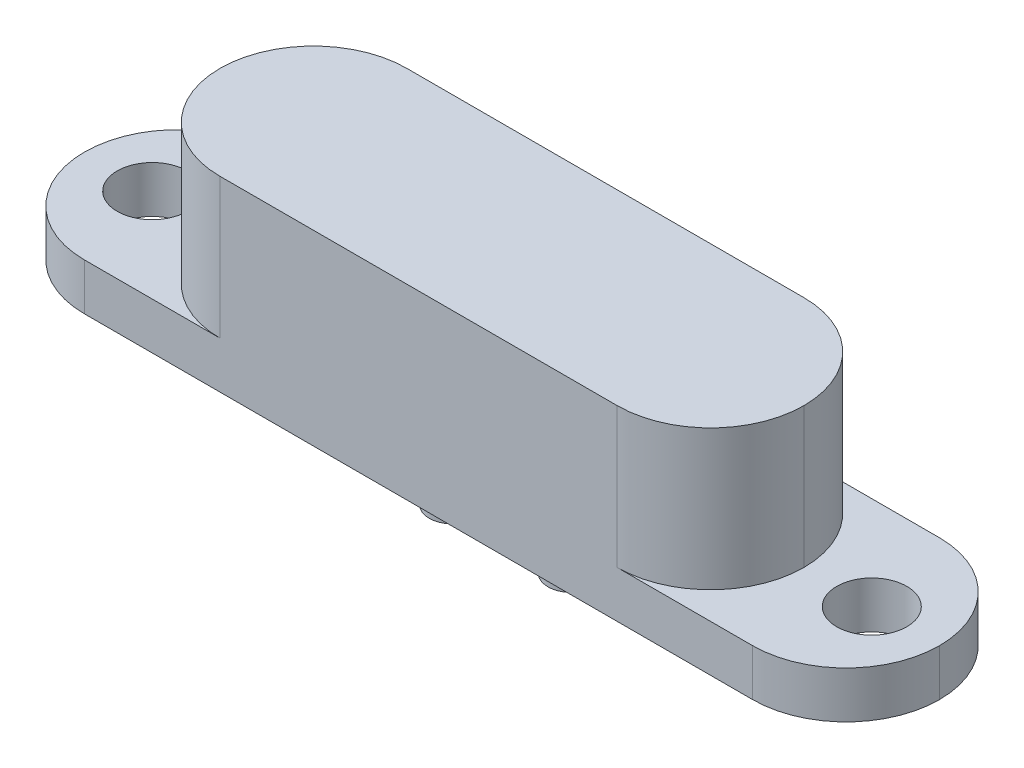
ISO-10303-21;
HEADER;
FILE_DESCRIPTION(('STEP AP214'),'2;1');
FILE_NAME('part.step','',(''),(''),'','','');
FILE_SCHEMA(('AUTOMOTIVE_DESIGN { 1 0 10303 214 1 1 1 1 }'));
ENDSEC;
DATA;
#1=APPLICATION_CONTEXT('core data for automotive mechanical design processes');
#2=APPLICATION_PROTOCOL_DEFINITION('international standard','automotive_design',2000,#1);
#3=PRODUCT_CONTEXT('',#1,'mechanical');
#4=PRODUCT('Part','Part','',(#3));
#5=PRODUCT_RELATED_PRODUCT_CATEGORY('part','',(#4));
#6=PRODUCT_DEFINITION_FORMATION('','',#4);
#7=PRODUCT_DEFINITION_CONTEXT('part definition',#1,'design');
#8=PRODUCT_DEFINITION('design','',#6,#7);
#9=PRODUCT_DEFINITION_SHAPE('','',#8);
#10=(LENGTH_UNIT() NAMED_UNIT(*) SI_UNIT(.MILLI.,.METRE.));
#11=(NAMED_UNIT(*) PLANE_ANGLE_UNIT() SI_UNIT($,.RADIAN.));
#12=(NAMED_UNIT(*) SI_UNIT($,.STERADIAN.) SOLID_ANGLE_UNIT());
#13=UNCERTAINTY_MEASURE_WITH_UNIT(LENGTH_MEASURE(1.E-05),#10,'distance_accuracy_value','');
#14=(GEOMETRIC_REPRESENTATION_CONTEXT(3) GLOBAL_UNCERTAINTY_ASSIGNED_CONTEXT((#13)) GLOBAL_UNIT_ASSIGNED_CONTEXT((#10,
#11,#12)) REPRESENTATION_CONTEXT('',''));
#15=CARTESIAN_POINT('',(0.,0.,0.));
#16=DIRECTION('',(0.,0.,1.));
#17=DIRECTION('',(1.,0.,0.));
#18=AXIS2_PLACEMENT_3D('',#15,#16,#17);
#19=CARTESIAN_POINT('',(-6.25,4.,2.));
#20=DIRECTION('',(0.,0.,-1.));
#21=DIRECTION('',(-1.,0.,0.));
#22=AXIS2_PLACEMENT_3D('',#19,#20,#21);
#23=PLANE('',#22);
#24=DIRECTION('',(1.,0.,0.));
#25=VECTOR('',#24,1.);
#26=CARTESIAN_POINT('',(-6.25,0.,2.));
#27=LINE('',#26,#25);
#28=CARTESIAN_POINT('',(-7.15,0.,2.));
#29=VERTEX_POINT('',#28);
#30=CARTESIAN_POINT('',(7.15,0.,2.));
#31=VERTEX_POINT('',#30);
#32=EDGE_CURVE('E165',#29,#31,#27,.T.);
#33=ORIENTED_EDGE('',*,*,#32,.T.);
#34=DIRECTION('',(0.,-1.,0.));
#35=VECTOR('',#34,1.);
#36=CARTESIAN_POINT('',(7.15,4.,2.));
#37=LINE('',#36,#35);
#38=CARTESIAN_POINT('',(7.15,1.,2.));
#39=VERTEX_POINT('',#38);
#40=EDGE_CURVE('E177',#31,#39,#37,.F.);
#41=ORIENTED_EDGE('',*,*,#40,.T.);
#42=DIRECTION('',(1.,0.,0.));
#43=VECTOR('',#42,1.);
#44=CARTESIAN_POINT('',(-9.15,1.,2.));
#45=LINE('',#44,#43);
#46=CARTESIAN_POINT('',(4.25,1.,2.));
#47=VERTEX_POINT('',#46);
#48=EDGE_CURVE('E138',#47,#39,#45,.T.);
#49=ORIENTED_EDGE('',*,*,#48,.F.);
#50=DIRECTION('',(0.,-1.,0.));
#51=VECTOR('',#50,1.);
#52=CARTESIAN_POINT('',(4.25,4.,2.));
#53=LINE('',#52,#51);
#54=CARTESIAN_POINT('',(4.25,4.,2.));
#55=VERTEX_POINT('',#54);
#56=EDGE_CURVE('E149',#47,#55,#53,.F.);
#57=ORIENTED_EDGE('',*,*,#56,.T.);
#58=DIRECTION('',(1.,0.,0.));
#59=VECTOR('',#58,1.);
#60=CARTESIAN_POINT('',(-6.25,4.,2.));
#61=LINE('',#60,#59);
#62=CARTESIAN_POINT('',(-4.25,4.,2.));
#63=VERTEX_POINT('',#62);
#64=EDGE_CURVE('E154',#63,#55,#61,.T.);
#65=ORIENTED_EDGE('',*,*,#64,.F.);
#66=DIRECTION('',(0.,-1.,0.));
#67=VECTOR('',#66,1.);
#68=CARTESIAN_POINT('',(-4.25,0.,2.));
#69=LINE('',#68,#67);
#70=CARTESIAN_POINT('',(-4.25,1.,2.));
#71=VERTEX_POINT('',#70);
#72=EDGE_CURVE('E145',#63,#71,#69,.T.);
#73=ORIENTED_EDGE('',*,*,#72,.T.);
#74=CARTESIAN_POINT('',(-7.15,1.,2.));
#75=VERTEX_POINT('',#74);
#76=EDGE_CURVE('E126',#75,#71,#45,.T.);
#77=ORIENTED_EDGE('',*,*,#76,.F.);
#78=DIRECTION('',(0.,-1.,0.));
#79=VECTOR('',#78,1.);
#80=CARTESIAN_POINT('',(-7.15,0.,2.));
#81=LINE('',#80,#79);
#82=EDGE_CURVE('E175',#75,#29,#81,.T.);
#83=ORIENTED_EDGE('',*,*,#82,.T.);
#84=EDGE_LOOP('',(#33,#41,#49,#57,#65,#73,#77,#83));
#85=FACE_BOUND('',#84,.T.);
#86=ADVANCED_FACE('F38',(#85),#23,.F.);
#87=CARTESIAN_POINT('',(-6.25,4.,-2.));
#88=DIRECTION('',(0.,0.,-1.));
#89=DIRECTION('',(-1.,0.,0.));
#90=AXIS2_PLACEMENT_3D('',#87,#88,#89);
#91=PLANE('',#90);
#92=DIRECTION('',(1.,0.,0.));
#93=VECTOR('',#92,1.);
#94=CARTESIAN_POINT('',(-9.15,1.,-2.));
#95=LINE('',#94,#93);
#96=CARTESIAN_POINT('',(4.25,1.,-2.));
#97=VERTEX_POINT('',#96);
#98=CARTESIAN_POINT('',(7.15,1.,-2.));
#99=VERTEX_POINT('',#98);
#100=EDGE_CURVE('E137',#97,#99,#95,.T.);
#101=ORIENTED_EDGE('',*,*,#100,.T.);
#102=DIRECTION('',(0.,-1.,0.));
#103=VECTOR('',#102,1.);
#104=CARTESIAN_POINT('',(7.15,0.,-2.));
#105=LINE('',#104,#103);
#106=CARTESIAN_POINT('',(7.15,0.,-2.));
#107=VERTEX_POINT('',#106);
#108=EDGE_CURVE('E185',#99,#107,#105,.T.);
#109=ORIENTED_EDGE('',*,*,#108,.T.);
#110=DIRECTION('',(1.,0.,0.));
#111=VECTOR('',#110,1.);
#112=CARTESIAN_POINT('',(-6.25,0.,-2.));
#113=LINE('',#112,#111);
#114=CARTESIAN_POINT('',(-7.15,0.,-2.));
#115=VERTEX_POINT('',#114);
#116=EDGE_CURVE('E228',#115,#107,#113,.T.);
#117=ORIENTED_EDGE('',*,*,#116,.F.);
#118=DIRECTION('',(0.,-1.,0.));
#119=VECTOR('',#118,1.);
#120=CARTESIAN_POINT('',(-7.15,4.,-2.));
#121=LINE('',#120,#119);
#122=CARTESIAN_POINT('',(-7.15,1.,-2.));
#123=VERTEX_POINT('',#122);
#124=EDGE_CURVE('E61',#115,#123,#121,.F.);
#125=ORIENTED_EDGE('',*,*,#124,.T.);
#126=CARTESIAN_POINT('',(-4.25,1.,-2.));
#127=VERTEX_POINT('',#126);
#128=EDGE_CURVE('E219',#123,#127,#95,.T.);
#129=ORIENTED_EDGE('',*,*,#128,.T.);
#130=DIRECTION('',(0.,-1.,0.));
#131=VECTOR('',#130,1.);
#132=CARTESIAN_POINT('',(-4.25,4.,-2.));
#133=LINE('',#132,#131);
#134=CARTESIAN_POINT('',(-4.25,4.,-2.));
#135=VERTEX_POINT('',#134);
#136=EDGE_CURVE('E231',#127,#135,#133,.F.);
#137=ORIENTED_EDGE('',*,*,#136,.T.);
#138=DIRECTION('',(1.,0.,0.));
#139=VECTOR('',#138,1.);
#140=CARTESIAN_POINT('',(-6.25,4.,-2.));
#141=LINE('',#140,#139);
#142=CARTESIAN_POINT('',(4.25,4.,-2.));
#143=VERTEX_POINT('',#142);
#144=EDGE_CURVE('E227',#135,#143,#141,.T.);
#145=ORIENTED_EDGE('',*,*,#144,.T.);
#146=DIRECTION('',(0.,-1.,0.));
#147=VECTOR('',#146,1.);
#148=CARTESIAN_POINT('',(4.25,0.,-2.));
#149=LINE('',#148,#147);
#150=EDGE_CURVE('E236',#143,#97,#149,.T.);
#151=ORIENTED_EDGE('',*,*,#150,.T.);
#152=EDGE_LOOP('',(#101,#109,#117,#125,#129,#137,#145,#151));
#153=FACE_BOUND('',#152,.T.);
#154=ADVANCED_FACE('F257',(#153),#91,.T.);
#155=CARTESIAN_POINT('',(0.,4.,0.));
#156=DIRECTION('',(0.,1.,0.));
#157=DIRECTION('',(0.,0.,1.));
#158=AXIS2_PLACEMENT_3D('',#155,#156,#157);
#159=PLANE('',#158);
#160=CARTESIAN_POINT('',(4.25,4.,0.));
#161=DIRECTION('',(0.,1.,0.));
#162=DIRECTION('',(0.,0.,1.));
#163=AXIS2_PLACEMENT_3D('',#160,#161,#162);
#164=CIRCLE('',#163,2.);
#165=CARTESIAN_POINT('',(6.25,4.,0.));
#166=VERTEX_POINT('',#165);
#167=EDGE_CURVE('E158',#55,#166,#164,.T.);
#168=ORIENTED_EDGE('',*,*,#167,.T.);
#169=CARTESIAN_POINT('',(4.25,4.,0.));
#170=DIRECTION('',(0.,1.,0.));
#171=DIRECTION('',(0.,0.,1.));
#172=AXIS2_PLACEMENT_3D('',#169,#170,#171);
#173=CIRCLE('',#172,2.);
#174=EDGE_CURVE('E155',#166,#143,#173,.T.);
#175=ORIENTED_EDGE('',*,*,#174,.T.);
#176=ORIENTED_EDGE('',*,*,#144,.F.);
#177=CARTESIAN_POINT('',(-4.25,4.,0.));
#178=DIRECTION('',(0.,1.,0.));
#179=DIRECTION('',(0.,0.,1.));
#180=AXIS2_PLACEMENT_3D('',#177,#178,#179);
#181=CIRCLE('',#180,2.);
#182=CARTESIAN_POINT('',(-6.25,4.,0.));
#183=VERTEX_POINT('',#182);
#184=EDGE_CURVE('E239',#135,#183,#181,.T.);
#185=ORIENTED_EDGE('',*,*,#184,.T.);
#186=CARTESIAN_POINT('',(-4.25,4.,0.));
#187=DIRECTION('',(0.,1.,0.));
#188=DIRECTION('',(0.,0.,1.));
#189=AXIS2_PLACEMENT_3D('',#186,#187,#188);
#190=CIRCLE('',#189,2.);
#191=EDGE_CURVE('E241',#183,#63,#190,.T.);
#192=ORIENTED_EDGE('',*,*,#191,.T.);
#193=ORIENTED_EDGE('',*,*,#64,.T.);
#194=EDGE_LOOP('',(#168,#175,#176,#185,#192,#193));
#195=FACE_BOUND('',#194,.T.);
#196=ADVANCED_FACE('F245',(#195),#159,.T.);
#197=CARTESIAN_POINT('',(0.,0.,0.));
#198=DIRECTION('',(0.,1.,0.));
#199=DIRECTION('',(0.,0.,1.));
#200=AXIS2_PLACEMENT_3D('',#197,#198,#199);
#201=PLANE('',#200);
#202=CARTESIAN_POINT('',(0.,0.,0.));
#203=DIRECTION('',(0.,-1.,0.));
#204=DIRECTION('',(0.,0.,-1.));
#205=AXIS2_PLACEMENT_3D('',#202,#203,#204);
#206=CIRCLE('',#205,0.5);
#207=CARTESIAN_POINT('',(0.,0.,-0.5));
#208=VERTEX_POINT('',#207);
#209=EDGE_CURVE('E530',#208,#208,#206,.T.);
#210=ORIENTED_EDGE('',*,*,#209,.F.);
#211=EDGE_LOOP('',(#210));
#212=FACE_BOUND('',#211,.T.);
#213=CARTESIAN_POINT('',(1.27,0.,0.));
#214=DIRECTION('',(0.,1.,0.));
#215=DIRECTION('',(0.,0.,1.));
#216=AXIS2_PLACEMENT_3D('',#213,#214,#215);
#217=CIRCLE('',#216,0.5);
#218=CARTESIAN_POINT('',(1.27,0.,0.5));
#219=VERTEX_POINT('',#218);
#220=EDGE_CURVE('E42',#219,#219,#217,.T.);
#221=ORIENTED_EDGE('',*,*,#220,.T.);
#222=EDGE_LOOP('',(#221));
#223=FACE_BOUND('',#222,.T.);
#224=CARTESIAN_POINT('',(-1.27,0.,0.));
#225=DIRECTION('',(0.,1.,0.));
#226=DIRECTION('',(0.,0.,1.));
#227=AXIS2_PLACEMENT_3D('',#224,#225,#226);
#228=CIRCLE('',#227,0.5);
#229=CARTESIAN_POINT('',(-1.27,0.,0.5));
#230=VERTEX_POINT('',#229);
#231=EDGE_CURVE('E194',#230,#230,#228,.T.);
#232=ORIENTED_EDGE('',*,*,#231,.T.);
#233=EDGE_LOOP('',(#232));
#234=FACE_BOUND('',#233,.T.);
#235=CARTESIAN_POINT('',(-7.7,0.,0.));
#236=DIRECTION('',(0.,1.,0.));
#237=DIRECTION('',(0.,0.,1.));
#238=AXIS2_PLACEMENT_3D('',#235,#236,#237);
#239=CIRCLE('',#238,0.75);
#240=CARTESIAN_POINT('',(-7.7,0.,0.75));
#241=VERTEX_POINT('',#240);
#242=EDGE_CURVE('E193',#241,#241,#239,.T.);
#243=ORIENTED_EDGE('',*,*,#242,.T.);
#244=EDGE_LOOP('',(#243));
#245=FACE_BOUND('',#244,.T.);
#246=CARTESIAN_POINT('',(7.7,0.,0.));
#247=DIRECTION('',(0.,1.,0.));
#248=DIRECTION('',(0.,0.,1.));
#249=AXIS2_PLACEMENT_3D('',#246,#247,#248);
#250=CIRCLE('',#249,0.75);
#251=CARTESIAN_POINT('',(7.7,0.,0.75));
#252=VERTEX_POINT('',#251);
#253=EDGE_CURVE('E196',#252,#252,#250,.T.);
#254=ORIENTED_EDGE('',*,*,#253,.T.);
#255=EDGE_LOOP('',(#254));
#256=FACE_BOUND('',#255,.T.);
#257=CARTESIAN_POINT('',(7.15,0.,0.));
#258=DIRECTION('',(0.,1.,0.));
#259=DIRECTION('',(0.,0.,1.));
#260=AXIS2_PLACEMENT_3D('',#257,#258,#259);
#261=CIRCLE('',#260,2.);
#262=CARTESIAN_POINT('',(9.15,0.,0.));
#263=VERTEX_POINT('',#262);
#264=EDGE_CURVE('E171',#107,#263,#261,.F.);
#265=ORIENTED_EDGE('',*,*,#264,.T.);
#266=CARTESIAN_POINT('',(7.15,0.,0.));
#267=DIRECTION('',(0.,1.,0.));
#268=DIRECTION('',(0.,0.,1.));
#269=AXIS2_PLACEMENT_3D('',#266,#267,#268);
#270=CIRCLE('',#269,2.);
#271=EDGE_CURVE('E173',#263,#31,#270,.F.);
#272=ORIENTED_EDGE('',*,*,#271,.T.);
#273=ORIENTED_EDGE('',*,*,#32,.F.);
#274=CARTESIAN_POINT('',(-7.15,0.,0.));
#275=DIRECTION('',(0.,1.,0.));
#276=DIRECTION('',(0.,0.,1.));
#277=AXIS2_PLACEMENT_3D('',#274,#275,#276);
#278=CIRCLE('',#277,2.);
#279=CARTESIAN_POINT('',(-9.15,0.,0.));
#280=VERTEX_POINT('',#279);
#281=EDGE_CURVE('E169',#29,#280,#278,.F.);
#282=ORIENTED_EDGE('',*,*,#281,.T.);
#283=CARTESIAN_POINT('',(-7.15,0.,0.));
#284=DIRECTION('',(0.,1.,0.));
#285=DIRECTION('',(0.,0.,1.));
#286=AXIS2_PLACEMENT_3D('',#283,#284,#285);
#287=CIRCLE('',#286,2.);
#288=EDGE_CURVE('E148',#280,#115,#287,.F.);
#289=ORIENTED_EDGE('',*,*,#288,.T.);
#290=ORIENTED_EDGE('',*,*,#116,.T.);
#291=EDGE_LOOP('',(#265,#272,#273,#282,#289,#290));
#292=FACE_BOUND('',#291,.T.);
#293=ADVANCED_FACE('F270',(#212,#223,#234,#245,#256,#292),#201,.F.);
#294=CARTESIAN_POINT('',(4.25,4.,0.));
#295=DIRECTION('',(0.,-1.,0.));
#296=DIRECTION('',(0.,0.,-1.));
#297=AXIS2_PLACEMENT_3D('',#294,#295,#296);
#298=CYLINDRICAL_SURFACE('',#297,2.);
#299=CARTESIAN_POINT('',(4.25,1.,0.));
#300=DIRECTION('',(0.,1.,0.));
#301=DIRECTION('',(0.,0.,1.));
#302=AXIS2_PLACEMENT_3D('',#299,#300,#301);
#303=CIRCLE('',#302,2.);
#304=CARTESIAN_POINT('',(6.25,1.,0.));
#305=VERTEX_POINT('',#304);
#306=EDGE_CURVE('E166',#305,#47,#303,.F.);
#307=ORIENTED_EDGE('',*,*,#306,.F.);
#308=DIRECTION('',(0.,-1.,0.));
#309=VECTOR('',#308,1.);
#310=CARTESIAN_POINT('',(6.25,4.,0.));
#311=LINE('',#310,#309);
#312=EDGE_CURVE('E162',#166,#305,#311,.T.);
#313=ORIENTED_EDGE('',*,*,#312,.F.);
#314=ORIENTED_EDGE('',*,*,#167,.F.);
#315=ORIENTED_EDGE('',*,*,#56,.F.);
#316=EDGE_LOOP('',(#307,#313,#314,#315));
#317=FACE_BOUND('',#316,.T.);
#318=ADVANCED_FACE('F251',(#317),#298,.T.);
#319=CARTESIAN_POINT('',(4.25,4.,0.));
#320=DIRECTION('',(0.,1.,0.));
#321=DIRECTION('',(0.,0.,1.));
#322=AXIS2_PLACEMENT_3D('',#319,#320,#321);
#323=CYLINDRICAL_SURFACE('',#322,2.);
#324=CARTESIAN_POINT('',(4.25,1.,0.));
#325=DIRECTION('',(0.,1.,0.));
#326=DIRECTION('',(0.,0.,1.));
#327=AXIS2_PLACEMENT_3D('',#324,#325,#326);
#328=CIRCLE('',#327,2.);
#329=EDGE_CURVE('E223',#97,#305,#328,.F.);
#330=ORIENTED_EDGE('',*,*,#329,.F.);
#331=ORIENTED_EDGE('',*,*,#150,.F.);
#332=ORIENTED_EDGE('',*,*,#174,.F.);
#333=ORIENTED_EDGE('',*,*,#312,.T.);
#334=EDGE_LOOP('',(#330,#331,#332,#333));
#335=FACE_BOUND('',#334,.T.);
#336=ADVANCED_FACE('F255',(#335),#323,.T.);
#337=CARTESIAN_POINT('',(-4.25,4.,0.));
#338=DIRECTION('',(0.,-1.,0.));
#339=DIRECTION('',(0.,0.,-1.));
#340=AXIS2_PLACEMENT_3D('',#337,#338,#339);
#341=CYLINDRICAL_SURFACE('',#340,2.);
#342=CARTESIAN_POINT('',(-4.25,1.,0.));
#343=DIRECTION('',(0.,1.,0.));
#344=DIRECTION('',(0.,0.,1.));
#345=AXIS2_PLACEMENT_3D('',#342,#343,#344);
#346=CIRCLE('',#345,2.);
#347=CARTESIAN_POINT('',(-6.25,1.,0.));
#348=VERTEX_POINT('',#347);
#349=EDGE_CURVE('E221',#348,#127,#346,.F.);
#350=ORIENTED_EDGE('',*,*,#349,.F.);
#351=DIRECTION('',(0.,-1.,0.));
#352=VECTOR('',#351,1.);
#353=CARTESIAN_POINT('',(-6.25,4.,0.));
#354=LINE('',#353,#352);
#355=EDGE_CURVE('E147',#183,#348,#354,.T.);
#356=ORIENTED_EDGE('',*,*,#355,.F.);
#357=ORIENTED_EDGE('',*,*,#184,.F.);
#358=ORIENTED_EDGE('',*,*,#136,.F.);
#359=EDGE_LOOP('',(#350,#356,#357,#358));
#360=FACE_BOUND('',#359,.T.);
#361=ADVANCED_FACE('F262',(#360),#341,.T.);
#362=CARTESIAN_POINT('',(-4.25,4.,0.));
#363=DIRECTION('',(0.,1.,0.));
#364=DIRECTION('',(0.,0.,1.));
#365=AXIS2_PLACEMENT_3D('',#362,#363,#364);
#366=CYLINDRICAL_SURFACE('',#365,2.);
#367=CARTESIAN_POINT('',(-4.25,1.,0.));
#368=DIRECTION('',(0.,1.,0.));
#369=DIRECTION('',(0.,0.,1.));
#370=AXIS2_PLACEMENT_3D('',#367,#368,#369);
#371=CIRCLE('',#370,2.);
#372=EDGE_CURVE('E130',#71,#348,#371,.F.);
#373=ORIENTED_EDGE('',*,*,#372,.F.);
#374=ORIENTED_EDGE('',*,*,#72,.F.);
#375=ORIENTED_EDGE('',*,*,#191,.F.);
#376=ORIENTED_EDGE('',*,*,#355,.T.);
#377=EDGE_LOOP('',(#373,#374,#375,#376));
#378=FACE_BOUND('',#377,.T.);
#379=ADVANCED_FACE('F143',(#378),#366,.T.);
#380=CARTESIAN_POINT('',(0.,1.,0.));
#381=DIRECTION('',(0.,1.,0.));
#382=DIRECTION('',(0.,0.,1.));
#383=AXIS2_PLACEMENT_3D('',#380,#381,#382);
#384=PLANE('',#383);
#385=CARTESIAN_POINT('',(-7.7,1.,0.));
#386=DIRECTION('',(0.,1.,0.));
#387=DIRECTION('',(0.,0.,1.));
#388=AXIS2_PLACEMENT_3D('',#385,#386,#387);
#389=CIRCLE('',#388,0.75);
#390=CARTESIAN_POINT('',(-7.7,1.,0.75));
#391=VERTEX_POINT('',#390);
#392=EDGE_CURVE('E214',#391,#391,#389,.T.);
#393=ORIENTED_EDGE('',*,*,#392,.F.);
#394=EDGE_LOOP('',(#393));
#395=FACE_BOUND('',#394,.T.);
#396=CARTESIAN_POINT('',(-7.15,1.,0.));
#397=DIRECTION('',(0.,1.,0.));
#398=DIRECTION('',(0.,0.,1.));
#399=AXIS2_PLACEMENT_3D('',#396,#397,#398);
#400=CIRCLE('',#399,2.);
#401=CARTESIAN_POINT('',(-9.15,1.,0.));
#402=VERTEX_POINT('',#401);
#403=EDGE_CURVE('E47',#123,#402,#400,.T.);
#404=ORIENTED_EDGE('',*,*,#403,.T.);
#405=CARTESIAN_POINT('',(-7.15,1.,0.));
#406=DIRECTION('',(0.,1.,0.));
#407=DIRECTION('',(0.,0.,1.));
#408=AXIS2_PLACEMENT_3D('',#405,#406,#407);
#409=CIRCLE('',#408,2.);
#410=EDGE_CURVE('E11',#402,#75,#409,.T.);
#411=ORIENTED_EDGE('',*,*,#410,.T.);
#412=ORIENTED_EDGE('',*,*,#76,.T.);
#413=ORIENTED_EDGE('',*,*,#372,.T.);
#414=ORIENTED_EDGE('',*,*,#349,.T.);
#415=ORIENTED_EDGE('',*,*,#128,.F.);
#416=EDGE_LOOP('',(#404,#411,#412,#413,#414,#415));
#417=FACE_BOUND('',#416,.T.);
#418=ADVANCED_FACE('F128',(#395,#417),#384,.T.);
#419=CARTESIAN_POINT('',(7.7,1.,0.));
#420=DIRECTION('',(0.,1.,0.));
#421=DIRECTION('',(0.,0.,1.));
#422=AXIS2_PLACEMENT_3D('',#419,#420,#421);
#423=CIRCLE('',#422,0.75);
#424=CARTESIAN_POINT('',(7.7,1.,0.75));
#425=VERTEX_POINT('',#424);
#426=EDGE_CURVE('E201',#425,#425,#423,.T.);
#427=ORIENTED_EDGE('',*,*,#426,.F.);
#428=EDGE_LOOP('',(#427));
#429=FACE_BOUND('',#428,.T.);
#430=ORIENTED_EDGE('',*,*,#48,.T.);
#431=CARTESIAN_POINT('',(7.15,1.,0.));
#432=DIRECTION('',(0.,1.,0.));
#433=DIRECTION('',(0.,0.,1.));
#434=AXIS2_PLACEMENT_3D('',#431,#432,#433);
#435=CIRCLE('',#434,2.);
#436=CARTESIAN_POINT('',(9.15,1.,0.));
#437=VERTEX_POINT('',#436);
#438=EDGE_CURVE('E182',#39,#437,#435,.T.);
#439=ORIENTED_EDGE('',*,*,#438,.T.);
#440=CARTESIAN_POINT('',(7.15,1.,0.));
#441=DIRECTION('',(0.,1.,0.));
#442=DIRECTION('',(0.,0.,1.));
#443=AXIS2_PLACEMENT_3D('',#440,#441,#442);
#444=CIRCLE('',#443,2.);
#445=EDGE_CURVE('E180',#437,#99,#444,.T.);
#446=ORIENTED_EDGE('',*,*,#445,.T.);
#447=ORIENTED_EDGE('',*,*,#100,.F.);
#448=ORIENTED_EDGE('',*,*,#329,.T.);
#449=ORIENTED_EDGE('',*,*,#306,.T.);
#450=EDGE_LOOP('',(#430,#439,#446,#447,#448,#449));
#451=FACE_BOUND('',#450,.T.);
#452=ADVANCED_FACE('F279',(#429,#451),#384,.T.);
#453=CARTESIAN_POINT('',(7.15,4.,0.));
#454=DIRECTION('',(0.,1.,0.));
#455=DIRECTION('',(0.,0.,1.));
#456=AXIS2_PLACEMENT_3D('',#453,#454,#455);
#457=CYLINDRICAL_SURFACE('',#456,2.);
#458=ORIENTED_EDGE('',*,*,#108,.F.);
#459=ORIENTED_EDGE('',*,*,#445,.F.);
#460=DIRECTION('',(0.,-1.,0.));
#461=VECTOR('',#460,1.);
#462=CARTESIAN_POINT('',(9.15,1.,0.));
#463=LINE('',#462,#461);
#464=EDGE_CURVE('E188',#263,#437,#463,.F.);
#465=ORIENTED_EDGE('',*,*,#464,.F.);
#466=ORIENTED_EDGE('',*,*,#264,.F.);
#467=EDGE_LOOP('',(#458,#459,#465,#466));
#468=FACE_BOUND('',#467,.T.);
#469=ADVANCED_FACE('F282',(#468),#457,.T.);
#470=CARTESIAN_POINT('',(7.15,1.,0.));
#471=DIRECTION('',(0.,-1.,0.));
#472=DIRECTION('',(0.,0.,-1.));
#473=AXIS2_PLACEMENT_3D('',#470,#471,#472);
#474=CYLINDRICAL_SURFACE('',#473,2.);
#475=ORIENTED_EDGE('',*,*,#438,.F.);
#476=ORIENTED_EDGE('',*,*,#40,.F.);
#477=ORIENTED_EDGE('',*,*,#271,.F.);
#478=ORIENTED_EDGE('',*,*,#464,.T.);
#479=EDGE_LOOP('',(#475,#476,#477,#478));
#480=FACE_BOUND('',#479,.T.);
#481=ADVANCED_FACE('F275',(#480),#474,.T.);
#482=CARTESIAN_POINT('',(-7.15,1.,0.));
#483=DIRECTION('',(0.,-1.,0.));
#484=DIRECTION('',(0.,0.,-1.));
#485=AXIS2_PLACEMENT_3D('',#482,#483,#484);
#486=CYLINDRICAL_SURFACE('',#485,2.);
#487=DIRECTION('',(0.,-1.,0.));
#488=VECTOR('',#487,1.);
#489=CARTESIAN_POINT('',(-9.15,1.,0.));
#490=LINE('',#489,#488);
#491=EDGE_CURVE('E191',#402,#280,#490,.T.);
#492=ORIENTED_EDGE('',*,*,#491,.F.);
#493=ORIENTED_EDGE('',*,*,#403,.F.);
#494=ORIENTED_EDGE('',*,*,#124,.F.);
#495=ORIENTED_EDGE('',*,*,#288,.F.);
#496=EDGE_LOOP('',(#492,#493,#494,#495));
#497=FACE_BOUND('',#496,.T.);
#498=ADVANCED_FACE('F40',(#497),#486,.T.);
#499=CARTESIAN_POINT('',(-7.15,4.,0.));
#500=DIRECTION('',(0.,1.,0.));
#501=DIRECTION('',(0.,0.,1.));
#502=AXIS2_PLACEMENT_3D('',#499,#500,#501);
#503=CYLINDRICAL_SURFACE('',#502,2.);
#504=ORIENTED_EDGE('',*,*,#410,.F.);
#505=ORIENTED_EDGE('',*,*,#491,.T.);
#506=ORIENTED_EDGE('',*,*,#281,.F.);
#507=ORIENTED_EDGE('',*,*,#82,.F.);
#508=EDGE_LOOP('',(#504,#505,#506,#507));
#509=FACE_BOUND('',#508,.T.);
#510=ADVANCED_FACE('F266',(#509),#503,.T.);
#511=CARTESIAN_POINT('',(7.7,0.,0.));
#512=DIRECTION('',(0.,1.,0.));
#513=DIRECTION('',(0.,0.,1.));
#514=AXIS2_PLACEMENT_3D('',#511,#512,#513);
#515=CYLINDRICAL_SURFACE('',#514,0.75);
#516=ORIENTED_EDGE('',*,*,#253,.F.);
#517=EDGE_LOOP('',(#516));
#518=FACE_BOUND('',#517,.T.);
#519=ORIENTED_EDGE('',*,*,#426,.T.);
#520=EDGE_LOOP('',(#519));
#521=FACE_BOUND('',#520,.T.);
#522=ADVANCED_FACE('F333',(#518,#521),#515,.F.);
#523=CARTESIAN_POINT('',(-7.7,0.,0.));
#524=DIRECTION('',(0.,1.,0.));
#525=DIRECTION('',(0.,0.,1.));
#526=AXIS2_PLACEMENT_3D('',#523,#524,#525);
#527=CYLINDRICAL_SURFACE('',#526,0.75);
#528=ORIENTED_EDGE('',*,*,#242,.F.);
#529=EDGE_LOOP('',(#528));
#530=FACE_BOUND('',#529,.T.);
#531=ORIENTED_EDGE('',*,*,#392,.T.);
#532=EDGE_LOOP('',(#531));
#533=FACE_BOUND('',#532,.T.);
#534=ADVANCED_FACE('F338',(#530,#533),#527,.F.);
#535=CARTESIAN_POINT('',(-1.27,-1.6,0.));
#536=DIRECTION('',(0.,1.,0.));
#537=DIRECTION('',(0.,0.,1.));
#538=AXIS2_PLACEMENT_3D('',#535,#536,#537);
#539=CYLINDRICAL_SURFACE('',#538,0.5);
#540=CARTESIAN_POINT('',(-1.27,-1.6,0.));
#541=DIRECTION('',(0.,1.,0.));
#542=DIRECTION('',(0.,0.,1.));
#543=AXIS2_PLACEMENT_3D('',#540,#541,#542);
#544=CIRCLE('',#543,0.5);
#545=CARTESIAN_POINT('',(-1.27,-1.6,0.5));
#546=VERTEX_POINT('',#545);
#547=EDGE_CURVE('E197',#546,#546,#544,.T.);
#548=ORIENTED_EDGE('',*,*,#547,.T.);
#549=EDGE_LOOP('',(#548));
#550=FACE_BOUND('',#549,.T.);
#551=ORIENTED_EDGE('',*,*,#231,.F.);
#552=EDGE_LOOP('',(#551));
#553=FACE_BOUND('',#552,.T.);
#554=ADVANCED_FACE('F351',(#550,#553),#539,.T.);
#555=CARTESIAN_POINT('',(-1.27,-1.6,0.));
#556=DIRECTION('',(0.,1.,0.));
#557=DIRECTION('',(0.,0.,1.));
#558=AXIS2_PLACEMENT_3D('',#555,#556,#557);
#559=PLANE('',#558);
#560=ORIENTED_EDGE('',*,*,#547,.F.);
#561=EDGE_LOOP('',(#560));
#562=FACE_BOUND('',#561,.T.);
#563=ADVANCED_FACE('F369',(#562),#559,.F.);
#564=CARTESIAN_POINT('',(1.27,-1.6,0.));
#565=DIRECTION('',(0.,1.,0.));
#566=DIRECTION('',(0.,0.,1.));
#567=AXIS2_PLACEMENT_3D('',#564,#565,#566);
#568=CYLINDRICAL_SURFACE('',#567,0.5);
#569=CARTESIAN_POINT('',(1.27,-1.6,0.));
#570=DIRECTION('',(0.,1.,0.));
#571=DIRECTION('',(0.,0.,1.));
#572=AXIS2_PLACEMENT_3D('',#569,#570,#571);
#573=CIRCLE('',#572,0.5);
#574=CARTESIAN_POINT('',(1.27,-1.6,0.5));
#575=VERTEX_POINT('',#574);
#576=EDGE_CURVE('E208',#575,#575,#573,.T.);
#577=ORIENTED_EDGE('',*,*,#576,.T.);
#578=EDGE_LOOP('',(#577));
#579=FACE_BOUND('',#578,.T.);
#580=ORIENTED_EDGE('',*,*,#220,.F.);
#581=EDGE_LOOP('',(#580));
#582=FACE_BOUND('',#581,.T.);
#583=ADVANCED_FACE('F379',(#579,#582),#568,.T.);
#584=CARTESIAN_POINT('',(1.27,-1.6,0.));
#585=DIRECTION('',(0.,1.,0.));
#586=DIRECTION('',(0.,0.,1.));
#587=AXIS2_PLACEMENT_3D('',#584,#585,#586);
#588=PLANE('',#587);
#589=ORIENTED_EDGE('',*,*,#576,.F.);
#590=EDGE_LOOP('',(#589));
#591=FACE_BOUND('',#590,.T.);
#592=ADVANCED_FACE('F390',(#591),#588,.F.);
#593=CARTESIAN_POINT('',(0.,0.1,0.));
#594=DIRECTION('',(0.,-1.,0.));
#595=DIRECTION('',(0.,0.,-1.));
#596=AXIS2_PLACEMENT_3D('',#593,#594,#595);
#597=CYLINDRICAL_SURFACE('',#596,0.5);
#598=CARTESIAN_POINT('',(0.,0.1,0.));
#599=DIRECTION('',(0.,-1.,0.));
#600=DIRECTION('',(0.,0.,-1.));
#601=AXIS2_PLACEMENT_3D('',#598,#599,#600);
#602=CIRCLE('',#601,0.5);
#603=CARTESIAN_POINT('',(0.,0.1,-0.5));
#604=VERTEX_POINT('',#603);
#605=EDGE_CURVE('E529',#604,#604,#602,.T.);
#606=ORIENTED_EDGE('',*,*,#605,.F.);
#607=EDGE_LOOP('',(#606));
#608=FACE_BOUND('',#607,.T.);
#609=ORIENTED_EDGE('',*,*,#209,.T.);
#610=EDGE_LOOP('',(#609));
#611=FACE_BOUND('',#610,.T.);
#612=ADVANCED_FACE('F401',(#608,#611),#597,.F.);
#613=CARTESIAN_POINT('',(0.,0.1,0.));
#614=DIRECTION('',(0.,-1.,0.));
#615=DIRECTION('',(0.,0.,-1.));
#616=AXIS2_PLACEMENT_3D('',#613,#614,#615);
#617=PLANE('',#616);
#618=ORIENTED_EDGE('',*,*,#605,.T.);
#619=EDGE_LOOP('',(#618));
#620=FACE_BOUND('',#619,.T.);
#621=ADVANCED_FACE('F417',(#620),#617,.T.);
#622=CLOSED_SHELL('',(#86,#154,#196,#293,#318,#336,#361,#379,#418,#452,#469,#481,#498,#510,#522,
#534,#554,#563,#583,#592,#612,#621));
#623=MANIFOLD_SOLID_BREP('B2',#622);
#624=ADVANCED_BREP_SHAPE_REPRESENTATION('',(#18,#623),#14);
#625=SHAPE_DEFINITION_REPRESENTATION(#9,#624);
ENDSEC;
END-ISO-10303-21;
